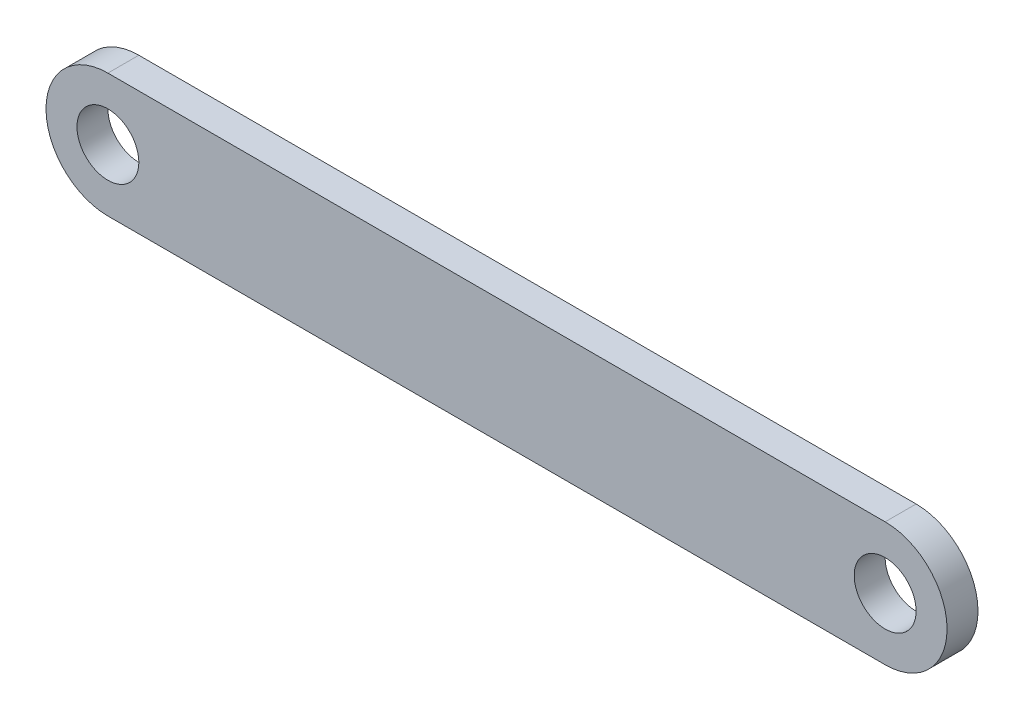
ISO-10303-21;
HEADER;
FILE_DESCRIPTION(('STEP AP214'),'2;1');
FILE_NAME('part.step','',(''),(''),'','','');
FILE_SCHEMA(('AUTOMOTIVE_DESIGN { 1 0 10303 214 1 1 1 1 }'));
ENDSEC;
DATA;
#1=APPLICATION_CONTEXT('core data for automotive mechanical design processes');
#2=APPLICATION_PROTOCOL_DEFINITION('international standard','automotive_design',2000,#1);
#3=PRODUCT_CONTEXT('',#1,'mechanical');
#4=PRODUCT('Part','Part','',(#3));
#5=PRODUCT_RELATED_PRODUCT_CATEGORY('part','',(#4));
#6=PRODUCT_DEFINITION_FORMATION('','',#4);
#7=PRODUCT_DEFINITION_CONTEXT('part definition',#1,'design');
#8=PRODUCT_DEFINITION('design','',#6,#7);
#9=PRODUCT_DEFINITION_SHAPE('','',#8);
#10=(LENGTH_UNIT() NAMED_UNIT(*) SI_UNIT(.MILLI.,.METRE.));
#11=(NAMED_UNIT(*) PLANE_ANGLE_UNIT() SI_UNIT($,.RADIAN.));
#12=(NAMED_UNIT(*) SI_UNIT($,.STERADIAN.) SOLID_ANGLE_UNIT());
#13=UNCERTAINTY_MEASURE_WITH_UNIT(LENGTH_MEASURE(1.E-05),#10,'distance_accuracy_value','');
#14=(GEOMETRIC_REPRESENTATION_CONTEXT(3) GLOBAL_UNCERTAINTY_ASSIGNED_CONTEXT((#13)) GLOBAL_UNIT_ASSIGNED_CONTEXT((#10,
#11,#12)) REPRESENTATION_CONTEXT('',''));
#15=CARTESIAN_POINT('',(0.,0.,0.));
#16=DIRECTION('',(0.,0.,1.));
#17=DIRECTION('',(1.,0.,0.));
#18=AXIS2_PLACEMENT_3D('',#15,#16,#17);
#19=CARTESIAN_POINT('',(0.,2.,1.));
#20=DIRECTION('',(0.,1.,0.));
#21=DIRECTION('',(-1.,0.,0.));
#22=AXIS2_PLACEMENT_3D('',#19,#20,#21);
#23=PLANE('',#22);
#24=DIRECTION('',(1.,0.,0.));
#25=VECTOR('',#24,1.);
#26=CARTESIAN_POINT('',(0.,2.,0.));
#27=LINE('',#26,#25);
#28=CARTESIAN_POINT('',(-25.1163,2.,0.));
#29=VERTEX_POINT('',#28);
#30=CARTESIAN_POINT('',(0.,2.,0.));
#31=VERTEX_POINT('',#30);
#32=EDGE_CURVE('E108',#29,#31,#27,.T.);
#33=ORIENTED_EDGE('',*,*,#32,.F.);
#34=DIRECTION('',(0.,0.,-1.));
#35=VECTOR('',#34,1.);
#36=CARTESIAN_POINT('',(-25.1163,2.,1.));
#37=LINE('',#36,#35);
#38=CARTESIAN_POINT('',(-25.1163,2.,1.));
#39=VERTEX_POINT('',#38);
#40=EDGE_CURVE('E11',#39,#29,#37,.T.);
#41=ORIENTED_EDGE('',*,*,#40,.F.);
#42=DIRECTION('',(1.,0.,0.));
#43=VECTOR('',#42,1.);
#44=CARTESIAN_POINT('',(0.,2.,1.));
#45=LINE('',#44,#43);
#46=CARTESIAN_POINT('',(0.,2.,1.));
#47=VERTEX_POINT('',#46);
#48=EDGE_CURVE('E90',#39,#47,#45,.T.);
#49=ORIENTED_EDGE('',*,*,#48,.T.);
#50=DIRECTION('',(0.,0.,-1.));
#51=VECTOR('',#50,1.);
#52=CARTESIAN_POINT('',(0.,2.,1.));
#53=LINE('',#52,#51);
#54=EDGE_CURVE('E78',#47,#31,#53,.T.);
#55=ORIENTED_EDGE('',*,*,#54,.T.);
#56=EDGE_LOOP('',(#33,#41,#49,#55));
#57=FACE_BOUND('',#56,.T.);
#58=ADVANCED_FACE('F39',(#57),#23,.T.);
#59=CARTESIAN_POINT('',(-25.1163,0.,1.));
#60=DIRECTION('',(0.,0.,-1.));
#61=DIRECTION('',(-1.,0.,0.));
#62=AXIS2_PLACEMENT_3D('',#59,#60,#61);
#63=CYLINDRICAL_SURFACE('',#62,2.);
#64=CARTESIAN_POINT('',(-25.1163,0.,0.));
#65=DIRECTION('',(0.,0.,1.));
#66=DIRECTION('',(1.,0.,0.));
#67=AXIS2_PLACEMENT_3D('',#64,#65,#66);
#68=CIRCLE('',#67,2.);
#69=CARTESIAN_POINT('',(-25.1163,-2.,0.));
#70=VERTEX_POINT('',#69);
#71=EDGE_CURVE('E95',#29,#70,#68,.T.);
#72=ORIENTED_EDGE('',*,*,#71,.T.);
#73=DIRECTION('',(0.,0.,-1.));
#74=VECTOR('',#73,1.);
#75=CARTESIAN_POINT('',(-25.1163,-2.,1.));
#76=LINE('',#75,#74);
#77=CARTESIAN_POINT('',(-25.1163,-2.,1.));
#78=VERTEX_POINT('',#77);
#79=EDGE_CURVE('E47',#78,#70,#76,.T.);
#80=ORIENTED_EDGE('',*,*,#79,.F.);
#81=CARTESIAN_POINT('',(-25.1163,0.,1.));
#82=DIRECTION('',(0.,0.,1.));
#83=DIRECTION('',(1.,0.,0.));
#84=AXIS2_PLACEMENT_3D('',#81,#82,#83);
#85=CIRCLE('',#84,2.);
#86=EDGE_CURVE('E84',#39,#78,#85,.T.);
#87=ORIENTED_EDGE('',*,*,#86,.F.);
#88=ORIENTED_EDGE('',*,*,#40,.T.);
#89=EDGE_LOOP('',(#72,#80,#87,#88));
#90=FACE_BOUND('',#89,.T.);
#91=ADVANCED_FACE('F93',(#90),#63,.T.);
#92=CARTESIAN_POINT('',(0.,-2.,1.));
#93=DIRECTION('',(0.,1.,0.));
#94=DIRECTION('',(-1.,0.,0.));
#95=AXIS2_PLACEMENT_3D('',#92,#93,#94);
#96=PLANE('',#95);
#97=DIRECTION('',(1.,0.,0.));
#98=VECTOR('',#97,1.);
#99=CARTESIAN_POINT('',(0.,-2.,0.));
#100=LINE('',#99,#98);
#101=CARTESIAN_POINT('',(0.,-2.,0.));
#102=VERTEX_POINT('',#101);
#103=EDGE_CURVE('E71',#70,#102,#100,.T.);
#104=ORIENTED_EDGE('',*,*,#103,.T.);
#105=DIRECTION('',(0.,0.,-1.));
#106=VECTOR('',#105,1.);
#107=CARTESIAN_POINT('',(0.,-2.,1.));
#108=LINE('',#107,#106);
#109=CARTESIAN_POINT('',(0.,-2.,1.));
#110=VERTEX_POINT('',#109);
#111=EDGE_CURVE('E96',#110,#102,#108,.T.);
#112=ORIENTED_EDGE('',*,*,#111,.F.);
#113=DIRECTION('',(1.,0.,0.));
#114=VECTOR('',#113,1.);
#115=CARTESIAN_POINT('',(0.,-2.,1.));
#116=LINE('',#115,#114);
#117=EDGE_CURVE('E89',#78,#110,#116,.T.);
#118=ORIENTED_EDGE('',*,*,#117,.F.);
#119=ORIENTED_EDGE('',*,*,#79,.T.);
#120=EDGE_LOOP('',(#104,#112,#118,#119));
#121=FACE_BOUND('',#120,.T.);
#122=ADVANCED_FACE('F97',(#121),#96,.F.);
#123=CARTESIAN_POINT('',(0.,0.,1.));
#124=DIRECTION('',(0.,0.,-1.));
#125=DIRECTION('',(-1.,0.,0.));
#126=AXIS2_PLACEMENT_3D('',#123,#124,#125);
#127=CYLINDRICAL_SURFACE('',#126,1.);
#128=CARTESIAN_POINT('',(0.,0.,1.));
#129=DIRECTION('',(0.,0.,1.));
#130=DIRECTION('',(1.,0.,0.));
#131=AXIS2_PLACEMENT_3D('',#128,#129,#130);
#132=CIRCLE('',#131,1.);
#133=CARTESIAN_POINT('',(1.,0.,1.));
#134=VERTEX_POINT('',#133);
#135=EDGE_CURVE('E99',#134,#134,#132,.T.);
#136=ORIENTED_EDGE('',*,*,#135,.T.);
#137=EDGE_LOOP('',(#136));
#138=FACE_BOUND('',#137,.T.);
#139=CARTESIAN_POINT('',(0.,0.,0.));
#140=DIRECTION('',(0.,0.,1.));
#141=DIRECTION('',(1.,0.,0.));
#142=AXIS2_PLACEMENT_3D('',#139,#140,#141);
#143=CIRCLE('',#142,1.);
#144=CARTESIAN_POINT('',(1.,0.,0.));
#145=VERTEX_POINT('',#144);
#146=EDGE_CURVE('E115',#145,#145,#143,.T.);
#147=ORIENTED_EDGE('',*,*,#146,.F.);
#148=EDGE_LOOP('',(#147));
#149=FACE_BOUND('',#148,.T.);
#150=ADVANCED_FACE('F135',(#138,#149),#127,.F.);
#151=CARTESIAN_POINT('',(0.,0.,1.));
#152=DIRECTION('',(0.,0.,-1.));
#153=DIRECTION('',(-1.,0.,0.));
#154=AXIS2_PLACEMENT_3D('',#151,#152,#153);
#155=CYLINDRICAL_SURFACE('',#154,2.);
#156=CARTESIAN_POINT('',(0.,0.,0.));
#157=DIRECTION('',(0.,0.,1.));
#158=DIRECTION('',(1.,0.,0.));
#159=AXIS2_PLACEMENT_3D('',#156,#157,#158);
#160=CIRCLE('',#159,2.);
#161=EDGE_CURVE('E113',#102,#31,#160,.T.);
#162=ORIENTED_EDGE('',*,*,#161,.T.);
#163=ORIENTED_EDGE('',*,*,#54,.F.);
#164=CARTESIAN_POINT('',(0.,0.,1.));
#165=DIRECTION('',(0.,0.,1.));
#166=DIRECTION('',(1.,0.,0.));
#167=AXIS2_PLACEMENT_3D('',#164,#165,#166);
#168=CIRCLE('',#167,2.);
#169=EDGE_CURVE('E55',#110,#47,#168,.T.);
#170=ORIENTED_EDGE('',*,*,#169,.F.);
#171=ORIENTED_EDGE('',*,*,#111,.T.);
#172=EDGE_LOOP('',(#162,#163,#170,#171));
#173=FACE_BOUND('',#172,.T.);
#174=ADVANCED_FACE('F124',(#173),#155,.T.);
#175=CARTESIAN_POINT('',(-25.1163,0.,1.));
#176=DIRECTION('',(0.,0.,-1.));
#177=DIRECTION('',(-1.,0.,0.));
#178=AXIS2_PLACEMENT_3D('',#175,#176,#177);
#179=CYLINDRICAL_SURFACE('',#178,1.);
#180=CARTESIAN_POINT('',(-25.1163,0.,1.));
#181=DIRECTION('',(0.,0.,1.));
#182=DIRECTION('',(1.,0.,0.));
#183=AXIS2_PLACEMENT_3D('',#180,#181,#182);
#184=CIRCLE('',#183,1.);
#185=CARTESIAN_POINT('',(-24.1163,0.,1.));
#186=VERTEX_POINT('',#185);
#187=EDGE_CURVE('E105',#186,#186,#184,.T.);
#188=ORIENTED_EDGE('',*,*,#187,.T.);
#189=EDGE_LOOP('',(#188));
#190=FACE_BOUND('',#189,.T.);
#191=CARTESIAN_POINT('',(-25.1163,0.,0.));
#192=DIRECTION('',(0.,0.,1.));
#193=DIRECTION('',(1.,0.,0.));
#194=AXIS2_PLACEMENT_3D('',#191,#192,#193);
#195=CIRCLE('',#194,1.);
#196=CARTESIAN_POINT('',(-24.1163,0.,0.));
#197=VERTEX_POINT('',#196);
#198=EDGE_CURVE('E118',#197,#197,#195,.T.);
#199=ORIENTED_EDGE('',*,*,#198,.F.);
#200=EDGE_LOOP('',(#199));
#201=FACE_BOUND('',#200,.T.);
#202=ADVANCED_FACE('F140',(#190,#201),#179,.F.);
#203=CARTESIAN_POINT('',(0.,0.,1.));
#204=DIRECTION('',(0.,0.,1.));
#205=DIRECTION('',(1.,0.,0.));
#206=AXIS2_PLACEMENT_3D('',#203,#204,#205);
#207=PLANE('',#206);
#208=ORIENTED_EDGE('',*,*,#48,.F.);
#209=ORIENTED_EDGE('',*,*,#86,.T.);
#210=ORIENTED_EDGE('',*,*,#117,.T.);
#211=ORIENTED_EDGE('',*,*,#169,.T.);
#212=EDGE_LOOP('',(#208,#209,#210,#211));
#213=FACE_BOUND('',#212,.T.);
#214=ORIENTED_EDGE('',*,*,#135,.F.);
#215=EDGE_LOOP('',(#214));
#216=FACE_BOUND('',#215,.T.);
#217=ORIENTED_EDGE('',*,*,#187,.F.);
#218=EDGE_LOOP('',(#217));
#219=FACE_BOUND('',#218,.T.);
#220=ADVANCED_FACE('F86',(#213,#216,#219),#207,.T.);
#221=CARTESIAN_POINT('',(0.,0.,0.));
#222=DIRECTION('',(0.,0.,1.));
#223=DIRECTION('',(1.,0.,0.));
#224=AXIS2_PLACEMENT_3D('',#221,#222,#223);
#225=PLANE('',#224);
#226=ORIENTED_EDGE('',*,*,#32,.T.);
#227=ORIENTED_EDGE('',*,*,#161,.F.);
#228=ORIENTED_EDGE('',*,*,#103,.F.);
#229=ORIENTED_EDGE('',*,*,#71,.F.);
#230=EDGE_LOOP('',(#226,#227,#228,#229));
#231=FACE_BOUND('',#230,.T.);
#232=ORIENTED_EDGE('',*,*,#146,.T.);
#233=EDGE_LOOP('',(#232));
#234=FACE_BOUND('',#233,.T.);
#235=ORIENTED_EDGE('',*,*,#198,.T.);
#236=EDGE_LOOP('',(#235));
#237=FACE_BOUND('',#236,.T.);
#238=ADVANCED_FACE('F126',(#231,#234,#237),#225,.F.);
#239=CLOSED_SHELL('',(#58,#91,#122,#150,#174,#202,#220,#238));
#240=MANIFOLD_SOLID_BREP('B2',#239);
#241=ADVANCED_BREP_SHAPE_REPRESENTATION('',(#18,#240),#14);
#242=SHAPE_DEFINITION_REPRESENTATION(#9,#241);
ENDSEC;
END-ISO-10303-21;
